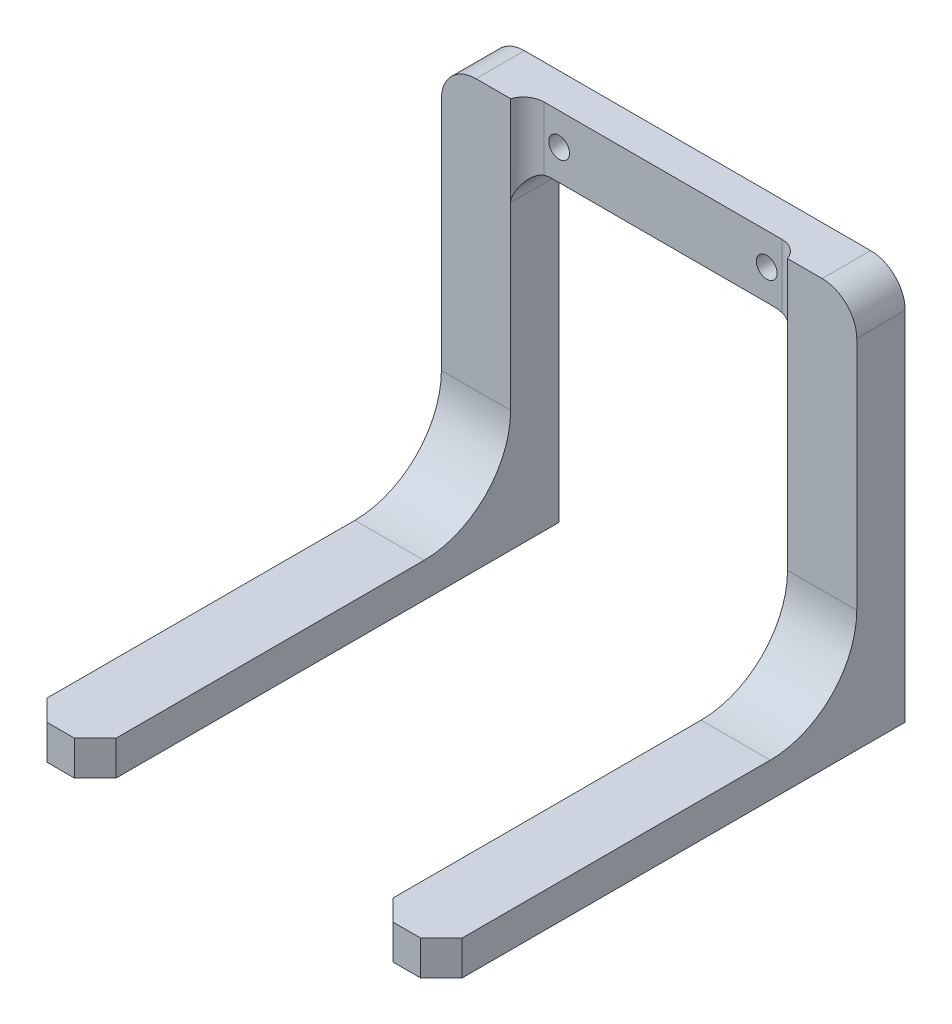
ISO-10303-21;
HEADER;
FILE_DESCRIPTION(('STEP AP214'),'2;1');
FILE_NAME('part.step','',(''),(''),'','','');
FILE_SCHEMA(('AUTOMOTIVE_DESIGN { 1 0 10303 214 1 1 1 1 }'));
ENDSEC;
DATA;
#1=APPLICATION_CONTEXT('core data for automotive mechanical design processes');
#2=APPLICATION_PROTOCOL_DEFINITION('international standard','automotive_design',2000,#1);
#3=PRODUCT_CONTEXT('',#1,'mechanical');
#4=PRODUCT('Part','Part','',(#3));
#5=PRODUCT_RELATED_PRODUCT_CATEGORY('part','',(#4));
#6=PRODUCT_DEFINITION_FORMATION('','',#4);
#7=PRODUCT_DEFINITION_CONTEXT('part definition',#1,'design');
#8=PRODUCT_DEFINITION('design','',#6,#7);
#9=PRODUCT_DEFINITION_SHAPE('','',#8);
#10=(LENGTH_UNIT() NAMED_UNIT(*) SI_UNIT(.MILLI.,.METRE.));
#11=(NAMED_UNIT(*) PLANE_ANGLE_UNIT() SI_UNIT($,.RADIAN.));
#12=(NAMED_UNIT(*) SI_UNIT($,.STERADIAN.) SOLID_ANGLE_UNIT());
#13=UNCERTAINTY_MEASURE_WITH_UNIT(LENGTH_MEASURE(1.E-05),#10,'distance_accuracy_value','');
#14=(GEOMETRIC_REPRESENTATION_CONTEXT(3) GLOBAL_UNCERTAINTY_ASSIGNED_CONTEXT((#13)) GLOBAL_UNIT_ASSIGNED_CONTEXT((#10,
#11,#12)) REPRESENTATION_CONTEXT('',''));
#15=CARTESIAN_POINT('',(0.,0.,0.));
#16=DIRECTION('',(0.,0.,1.));
#17=DIRECTION('',(1.,0.,0.));
#18=AXIS2_PLACEMENT_3D('',#15,#16,#17);
#19=CARTESIAN_POINT('',(-30.,9.,3.5));
#20=DIRECTION('',(0.,0.,-1.));
#21=DIRECTION('',(-1.,0.,0.));
#22=AXIS2_PLACEMENT_3D('',#19,#20,#21);
#23=PLANE('',#22);
#24=DIRECTION('',(0.,1.,0.));
#25=VECTOR('',#24,1.);
#26=CARTESIAN_POINT('',(20.,-47.5,3.5));
#27=LINE('',#26,#25);
#28=CARTESIAN_POINT('',(20.,-30.,3.5));
#29=VERTEX_POINT('',#28);
#30=CARTESIAN_POINT('',(20.,-4.,3.5));
#31=VERTEX_POINT('',#30);
#32=EDGE_CURVE('E230',#29,#31,#27,.T.);
#33=ORIENTED_EDGE('',*,*,#32,.F.);
#34=DIRECTION('',(-1.,0.,0.));
#35=VECTOR('',#34,1.);
#36=CARTESIAN_POINT('',(30.,-30.,3.5));
#37=LINE('',#36,#35);
#38=CARTESIAN_POINT('',(30.,-30.,3.5));
#39=VERTEX_POINT('',#38);
#40=EDGE_CURVE('E533',#29,#39,#37,.F.);
#41=ORIENTED_EDGE('',*,*,#40,.T.);
#42=DIRECTION('',(0.,-1.,0.));
#43=VECTOR('',#42,1.);
#44=CARTESIAN_POINT('',(30.,9.,3.5));
#45=LINE('',#44,#43);
#46=CARTESIAN_POINT('',(30.,4.,3.5));
#47=VERTEX_POINT('',#46);
#48=EDGE_CURVE('E264',#47,#39,#45,.T.);
#49=ORIENTED_EDGE('',*,*,#48,.F.);
#50=CARTESIAN_POINT('',(25.,4.,3.5));
#51=DIRECTION('',(0.,0.,-1.));
#52=DIRECTION('',(-1.,0.,0.));
#53=AXIS2_PLACEMENT_3D('',#50,#51,#52);
#54=CIRCLE('',#53,5.);
#55=CARTESIAN_POINT('',(25.,9.,3.5));
#56=VERTEX_POINT('',#55);
#57=EDGE_CURVE('E297',#47,#56,#54,.F.);
#58=ORIENTED_EDGE('',*,*,#57,.T.);
#59=DIRECTION('',(1.,0.,0.));
#60=VECTOR('',#59,1.);
#61=CARTESIAN_POINT('',(-30.,9.,3.5));
#62=LINE('',#61,#60);
#63=CARTESIAN_POINT('',(20.,9.,3.5));
#64=VERTEX_POINT('',#63);
#65=EDGE_CURVE('E261',#64,#56,#62,.T.);
#66=ORIENTED_EDGE('',*,*,#65,.F.);
#67=DIRECTION('',(0.,1.,0.));
#68=VECTOR('',#67,1.);
#69=CARTESIAN_POINT('',(20.,9.,3.5));
#70=LINE('',#69,#68);
#71=EDGE_CURVE('E250',#31,#64,#70,.T.);
#72=ORIENTED_EDGE('',*,*,#71,.F.);
#73=EDGE_LOOP('',(#33,#41,#49,#58,#66,#72));
#74=FACE_BOUND('',#73,.T.);
#75=ADVANCED_FACE('F33',(#74),#23,.F.);
#76=DIRECTION('',(0.,-1.,0.));
#77=VECTOR('',#76,1.);
#78=CARTESIAN_POINT('',(-30.,9.,3.5));
#79=LINE('',#78,#77);
#80=CARTESIAN_POINT('',(-30.,4.,3.5));
#81=VERTEX_POINT('',#80);
#82=CARTESIAN_POINT('',(-30.,-30.,3.5));
#83=VERTEX_POINT('',#82);
#84=EDGE_CURVE('E269',#81,#83,#79,.T.);
#85=ORIENTED_EDGE('',*,*,#84,.T.);
#86=DIRECTION('',(-1.,0.,0.));
#87=VECTOR('',#86,1.);
#88=CARTESIAN_POINT('',(-20.,-30.,3.5));
#89=LINE('',#88,#87);
#90=CARTESIAN_POINT('',(-20.,-30.,3.5));
#91=VERTEX_POINT('',#90);
#92=EDGE_CURVE('E438',#83,#91,#89,.F.);
#93=ORIENTED_EDGE('',*,*,#92,.T.);
#94=DIRECTION('',(0.,1.,0.));
#95=VECTOR('',#94,1.);
#96=CARTESIAN_POINT('',(-20.,-47.5,3.5));
#97=LINE('',#96,#95);
#98=CARTESIAN_POINT('',(-20.,-4.,3.5));
#99=VERTEX_POINT('',#98);
#100=EDGE_CURVE('E243',#91,#99,#97,.T.);
#101=ORIENTED_EDGE('',*,*,#100,.T.);
#102=DIRECTION('',(0.,-1.,0.));
#103=VECTOR('',#102,1.);
#104=CARTESIAN_POINT('',(-20.,9.,3.5));
#105=LINE('',#104,#103);
#106=CARTESIAN_POINT('',(-20.,9.,3.5));
#107=VERTEX_POINT('',#106);
#108=EDGE_CURVE('E245',#107,#99,#105,.T.);
#109=ORIENTED_EDGE('',*,*,#108,.F.);
#110=CARTESIAN_POINT('',(-25.,9.,3.5));
#111=VERTEX_POINT('',#110);
#112=EDGE_CURVE('E262',#111,#107,#62,.T.);
#113=ORIENTED_EDGE('',*,*,#112,.F.);
#114=CARTESIAN_POINT('',(-25.,4.,3.5));
#115=DIRECTION('',(0.,0.,-1.));
#116=DIRECTION('',(-1.,0.,0.));
#117=AXIS2_PLACEMENT_3D('',#114,#115,#116);
#118=CIRCLE('',#117,5.);
#119=EDGE_CURVE('E299',#111,#81,#118,.F.);
#120=ORIENTED_EDGE('',*,*,#119,.T.);
#121=EDGE_LOOP('',(#85,#93,#101,#109,#113,#120));
#122=FACE_BOUND('',#121,.T.);
#123=ADVANCED_FACE('F374',(#122),#23,.F.);
#124=CARTESIAN_POINT('',(0.,0.,0.));
#125=DIRECTION('',(0.,1.,0.));
#126=DIRECTION('',(0.,0.,1.));
#127=AXIS2_PLACEMENT_3D('',#124,#125,#126);
#128=PLANE('',#127);
#129=DIRECTION('',(-1.,0.,0.));
#130=VECTOR('',#129,1.);
#131=CARTESIAN_POINT('',(-30.,0.,-3.5));
#132=LINE('',#131,#130);
#133=CARTESIAN_POINT('',(16.,0.,-3.5));
#134=VERTEX_POINT('',#133);
#135=CARTESIAN_POINT('',(-16.,0.,-3.5));
#136=VERTEX_POINT('',#135);
#137=EDGE_CURVE('E253',#134,#136,#132,.T.);
#138=ORIENTED_EDGE('',*,*,#137,.F.);
#139=DIRECTION('',(0.,0.,-1.));
#140=VECTOR('',#139,1.);
#141=CARTESIAN_POINT('',(16.,0.,3.5));
#142=LINE('',#141,#140);
#143=CARTESIAN_POINT('',(16.,0.,1.5));
#144=VERTEX_POINT('',#143);
#145=EDGE_CURVE('E306',#134,#144,#142,.F.);
#146=ORIENTED_EDGE('',*,*,#145,.T.);
#147=DIRECTION('',(1.,0.,0.));
#148=VECTOR('',#147,1.);
#149=CARTESIAN_POINT('',(-20.,0.,1.5));
#150=LINE('',#149,#148);
#151=CARTESIAN_POINT('',(-16.,0.,1.5));
#152=VERTEX_POINT('',#151);
#153=EDGE_CURVE('E246',#152,#144,#150,.T.);
#154=ORIENTED_EDGE('',*,*,#153,.F.);
#155=DIRECTION('',(0.,0.,1.));
#156=VECTOR('',#155,1.);
#157=CARTESIAN_POINT('',(-16.,0.,-3.5));
#158=LINE('',#157,#156);
#159=EDGE_CURVE('E304',#152,#136,#158,.F.);
#160=ORIENTED_EDGE('',*,*,#159,.T.);
#161=EDGE_LOOP('',(#138,#146,#154,#160));
#162=FACE_BOUND('',#161,.T.);
#163=ADVANCED_FACE('F380',(#162),#128,.F.);
#164=CARTESIAN_POINT('',(30.,9.,-3.5));
#165=DIRECTION('',(-1.,0.,0.));
#166=DIRECTION('',(0.,0.,1.));
#167=AXIS2_PLACEMENT_3D('',#164,#165,#166);
#168=PLANE('',#167);
#169=DIRECTION('',(0.,0.,-1.));
#170=VECTOR('',#169,1.);
#171=CARTESIAN_POINT('',(30.,-42.5,63.5));
#172=LINE('',#171,#170);
#173=CARTESIAN_POINT('',(30.,-42.5,60.5));
#174=VERTEX_POINT('',#173);
#175=CARTESIAN_POINT('',(30.,-42.5,16.));
#176=VERTEX_POINT('',#175);
#177=EDGE_CURVE('E505',#174,#176,#172,.T.);
#178=ORIENTED_EDGE('',*,*,#177,.F.);
#179=DIRECTION('',(0.,-1.,0.));
#180=VECTOR('',#179,1.);
#181=CARTESIAN_POINT('',(30.,9.,60.5));
#182=LINE('',#181,#180);
#183=CARTESIAN_POINT('',(30.,-47.5,60.5));
#184=VERTEX_POINT('',#183);
#185=EDGE_CURVE('E464',#174,#184,#182,.T.);
#186=ORIENTED_EDGE('',*,*,#185,.T.);
#187=DIRECTION('',(0.,0.,1.));
#188=VECTOR('',#187,1.);
#189=CARTESIAN_POINT('',(30.,-47.5,3.5));
#190=LINE('',#189,#188);
#191=CARTESIAN_POINT('',(30.,-47.5,-3.5));
#192=VERTEX_POINT('',#191);
#193=EDGE_CURVE('E223',#192,#184,#190,.T.);
#194=ORIENTED_EDGE('',*,*,#193,.F.);
#195=DIRECTION('',(0.,-1.,0.));
#196=VECTOR('',#195,1.);
#197=CARTESIAN_POINT('',(30.,9.,-3.5));
#198=LINE('',#197,#196);
#199=CARTESIAN_POINT('',(30.,4.,-3.5));
#200=VERTEX_POINT('',#199);
#201=EDGE_CURVE('E222',#200,#192,#198,.T.);
#202=ORIENTED_EDGE('',*,*,#201,.F.);
#203=DIRECTION('',(0.,0.,-1.));
#204=VECTOR('',#203,1.);
#205=CARTESIAN_POINT('',(30.,4.,3.5));
#206=LINE('',#205,#204);
#207=EDGE_CURVE('E295',#200,#47,#206,.F.);
#208=ORIENTED_EDGE('',*,*,#207,.T.);
#209=ORIENTED_EDGE('',*,*,#48,.T.);
#210=CARTESIAN_POINT('',(30.,-30.,16.));
#211=DIRECTION('',(-1.,0.,0.));
#212=DIRECTION('',(0.,0.,1.));
#213=AXIS2_PLACEMENT_3D('',#210,#211,#212);
#214=CIRCLE('',#213,12.5);
#215=EDGE_CURVE('E454',#39,#176,#214,.T.);
#216=ORIENTED_EDGE('',*,*,#215,.T.);
#217=EDGE_LOOP('',(#178,#186,#194,#202,#208,#209,#216));
#218=FACE_BOUND('',#217,.T.);
#219=ADVANCED_FACE('F393',(#218),#168,.F.);
#220=CARTESIAN_POINT('',(-30.,9.,-3.5));
#221=DIRECTION('',(0.,0.,1.));
#222=DIRECTION('',(1.,0.,0.));
#223=AXIS2_PLACEMENT_3D('',#220,#221,#222);
#224=PLANE('',#223);
#225=CARTESIAN_POINT('',(14.9914863383138,4.41229031516984,-3.5));
#226=DIRECTION('',(0.,0.,-1.));
#227=DIRECTION('',(-1.,0.,0.));
#228=AXIS2_PLACEMENT_3D('',#225,#226,#227);
#229=CIRCLE('',#228,1.5);
#230=CARTESIAN_POINT('',(13.4914863383138,4.41229031516984,-3.5));
#231=VERTEX_POINT('',#230);
#232=EDGE_CURVE('E485',#231,#231,#229,.T.);
#233=ORIENTED_EDGE('',*,*,#232,.F.);
#234=EDGE_LOOP('',(#233));
#235=FACE_BOUND('',#234,.T.);
#236=CARTESIAN_POINT('',(-14.9914863383138,4.41229031516984,-3.5));
#237=DIRECTION('',(0.,0.,-1.));
#238=DIRECTION('',(-1.,0.,0.));
#239=AXIS2_PLACEMENT_3D('',#236,#237,#238);
#240=CIRCLE('',#239,1.5);
#241=CARTESIAN_POINT('',(-16.4914863383138,4.41229031516984,-3.5));
#242=VERTEX_POINT('',#241);
#243=EDGE_CURVE('E491',#242,#242,#240,.T.);
#244=ORIENTED_EDGE('',*,*,#243,.F.);
#245=EDGE_LOOP('',(#244));
#246=FACE_BOUND('',#245,.T.);
#247=DIRECTION('',(-1.,0.,0.));
#248=VECTOR('',#247,1.);
#249=CARTESIAN_POINT('',(-30.,9.,-3.5));
#250=LINE('',#249,#248);
#251=CARTESIAN_POINT('',(25.,9.,-3.5));
#252=VERTEX_POINT('',#251);
#253=CARTESIAN_POINT('',(-25.,9.,-3.5));
#254=VERTEX_POINT('',#253);
#255=EDGE_CURVE('E258',#252,#254,#250,.T.);
#256=ORIENTED_EDGE('',*,*,#255,.F.);
#257=CARTESIAN_POINT('',(25.,4.,-3.5));
#258=DIRECTION('',(0.,0.,1.));
#259=DIRECTION('',(1.,0.,0.));
#260=AXIS2_PLACEMENT_3D('',#257,#258,#259);
#261=CIRCLE('',#260,5.);
#262=EDGE_CURVE('E293',#252,#200,#261,.F.);
#263=ORIENTED_EDGE('',*,*,#262,.T.);
#264=ORIENTED_EDGE('',*,*,#201,.T.);
#265=DIRECTION('',(1.,0.,0.));
#266=VECTOR('',#265,1.);
#267=CARTESIAN_POINT('',(20.,-47.5,-3.5));
#268=LINE('',#267,#266);
#269=CARTESIAN_POINT('',(20.,-47.5,-3.5));
#270=VERTEX_POINT('',#269);
#271=EDGE_CURVE('E207',#270,#192,#268,.T.);
#272=ORIENTED_EDGE('',*,*,#271,.F.);
#273=DIRECTION('',(0.,1.,0.));
#274=VECTOR('',#273,1.);
#275=CARTESIAN_POINT('',(20.,-47.5,-3.5));
#276=LINE('',#275,#274);
#277=CARTESIAN_POINT('',(20.,-4.,-3.5));
#278=VERTEX_POINT('',#277);
#279=EDGE_CURVE('E220',#270,#278,#276,.T.);
#280=ORIENTED_EDGE('',*,*,#279,.T.);
#281=CARTESIAN_POINT('',(16.,-4.,-3.5));
#282=DIRECTION('',(0.,0.,1.));
#283=DIRECTION('',(1.,0.,0.));
#284=AXIS2_PLACEMENT_3D('',#281,#282,#283);
#285=CIRCLE('',#284,4.);
#286=EDGE_CURVE('E311',#278,#134,#285,.T.);
#287=ORIENTED_EDGE('',*,*,#286,.T.);
#288=ORIENTED_EDGE('',*,*,#137,.T.);
#289=CARTESIAN_POINT('',(-16.,-4.,-3.5));
#290=DIRECTION('',(0.,0.,1.));
#291=DIRECTION('',(1.,0.,0.));
#292=AXIS2_PLACEMENT_3D('',#289,#290,#291);
#293=CIRCLE('',#292,4.);
#294=CARTESIAN_POINT('',(-20.,-4.,-3.5));
#295=VERTEX_POINT('',#294);
#296=EDGE_CURVE('E536',#136,#295,#293,.T.);
#297=ORIENTED_EDGE('',*,*,#296,.T.);
#298=DIRECTION('',(0.,1.,0.));
#299=VECTOR('',#298,1.);
#300=CARTESIAN_POINT('',(-20.,-47.5,-3.5));
#301=LINE('',#300,#299);
#302=CARTESIAN_POINT('',(-20.,-47.5,-3.5));
#303=VERTEX_POINT('',#302);
#304=EDGE_CURVE('E240',#303,#295,#301,.T.);
#305=ORIENTED_EDGE('',*,*,#304,.F.);
#306=DIRECTION('',(1.,0.,0.));
#307=VECTOR('',#306,1.);
#308=CARTESIAN_POINT('',(-20.,-47.5,-3.5));
#309=LINE('',#308,#307);
#310=CARTESIAN_POINT('',(-30.,-47.5,-3.5));
#311=VERTEX_POINT('',#310);
#312=EDGE_CURVE('E238',#311,#303,#309,.T.);
#313=ORIENTED_EDGE('',*,*,#312,.F.);
#314=DIRECTION('',(0.,-1.,0.));
#315=VECTOR('',#314,1.);
#316=CARTESIAN_POINT('',(-30.,9.,-3.5));
#317=LINE('',#316,#315);
#318=CARTESIAN_POINT('',(-30.,4.,-3.5));
#319=VERTEX_POINT('',#318);
#320=EDGE_CURVE('E272',#319,#311,#317,.T.);
#321=ORIENTED_EDGE('',*,*,#320,.F.);
#322=CARTESIAN_POINT('',(-25.,4.,-3.5));
#323=DIRECTION('',(0.,0.,1.));
#324=DIRECTION('',(1.,0.,0.));
#325=AXIS2_PLACEMENT_3D('',#322,#323,#324);
#326=CIRCLE('',#325,5.);
#327=EDGE_CURVE('E291',#319,#254,#326,.F.);
#328=ORIENTED_EDGE('',*,*,#327,.T.);
#329=EDGE_LOOP('',(#256,#263,#264,#272,#280,#287,#288,#297,#305,#313,#321,#328));
#330=FACE_BOUND('',#329,.T.);
#331=ADVANCED_FACE('F219',(#235,#246,#330),#224,.F.);
#332=CARTESIAN_POINT('',(-30.,9.,-3.5));
#333=DIRECTION('',(1.,0.,0.));
#334=DIRECTION('',(0.,0.,-1.));
#335=AXIS2_PLACEMENT_3D('',#332,#333,#334);
#336=PLANE('',#335);
#337=DIRECTION('',(0.,0.,-1.));
#338=VECTOR('',#337,1.);
#339=CARTESIAN_POINT('',(-30.,-47.5,3.5));
#340=LINE('',#339,#338);
#341=CARTESIAN_POINT('',(-30.,-47.5,60.5));
#342=VERTEX_POINT('',#341);
#343=EDGE_CURVE('E232',#342,#311,#340,.T.);
#344=ORIENTED_EDGE('',*,*,#343,.F.);
#345=DIRECTION('',(0.,1.,0.));
#346=VECTOR('',#345,1.);
#347=CARTESIAN_POINT('',(-30.,9.,60.5));
#348=LINE('',#347,#346);
#349=CARTESIAN_POINT('',(-30.,-42.5,60.5));
#350=VERTEX_POINT('',#349);
#351=EDGE_CURVE('E11',#342,#350,#348,.T.);
#352=ORIENTED_EDGE('',*,*,#351,.T.);
#353=DIRECTION('',(0.,0.,-1.));
#354=VECTOR('',#353,1.);
#355=CARTESIAN_POINT('',(-30.,-42.5,63.5));
#356=LINE('',#355,#354);
#357=CARTESIAN_POINT('',(-30.,-42.5,16.));
#358=VERTEX_POINT('',#357);
#359=EDGE_CURVE('E513',#350,#358,#356,.T.);
#360=ORIENTED_EDGE('',*,*,#359,.T.);
#361=CARTESIAN_POINT('',(-30.,-30.,16.));
#362=DIRECTION('',(1.,0.,0.));
#363=DIRECTION('',(0.,0.,-1.));
#364=AXIS2_PLACEMENT_3D('',#361,#362,#363);
#365=CIRCLE('',#364,12.5);
#366=EDGE_CURVE('E449',#358,#83,#365,.T.);
#367=ORIENTED_EDGE('',*,*,#366,.T.);
#368=ORIENTED_EDGE('',*,*,#84,.F.);
#369=DIRECTION('',(0.,0.,1.));
#370=VECTOR('',#369,1.);
#371=CARTESIAN_POINT('',(-30.,4.,-3.5));
#372=LINE('',#371,#370);
#373=EDGE_CURVE('E301',#81,#319,#372,.F.);
#374=ORIENTED_EDGE('',*,*,#373,.T.);
#375=ORIENTED_EDGE('',*,*,#320,.T.);
#376=EDGE_LOOP('',(#344,#352,#360,#367,#368,#374,#375));
#377=FACE_BOUND('',#376,.T.);
#378=ADVANCED_FACE('F386',(#377),#336,.F.);
#379=CARTESIAN_POINT('',(0.,9.,0.));
#380=DIRECTION('',(0.,1.,0.));
#381=DIRECTION('',(0.,0.,1.));
#382=AXIS2_PLACEMENT_3D('',#379,#380,#381);
#383=PLANE('',#382);
#384=ORIENTED_EDGE('',*,*,#65,.T.);
#385=DIRECTION('',(0.,0.,-1.));
#386=VECTOR('',#385,1.);
#387=CARTESIAN_POINT('',(25.,9.,-3.5));
#388=LINE('',#387,#386);
#389=EDGE_CURVE('E288',#56,#252,#388,.T.);
#390=ORIENTED_EDGE('',*,*,#389,.T.);
#391=ORIENTED_EDGE('',*,*,#255,.T.);
#392=DIRECTION('',(0.,0.,1.));
#393=VECTOR('',#392,1.);
#394=CARTESIAN_POINT('',(-25.,9.,3.5));
#395=LINE('',#394,#393);
#396=EDGE_CURVE('E285',#254,#111,#395,.T.);
#397=ORIENTED_EDGE('',*,*,#396,.T.);
#398=ORIENTED_EDGE('',*,*,#112,.T.);
#399=CARTESIAN_POINT('',(-17.1715728752538,9.,4.5));
#400=DIRECTION('',(0.,1.,0.));
#401=DIRECTION('',(0.,0.,1.));
#402=AXIS2_PLACEMENT_3D('',#399,#400,#401);
#403=CIRCLE('',#402,3.);
#404=CARTESIAN_POINT('',(-17.1715728752538,9.,1.5));
#405=VERTEX_POINT('',#404);
#406=EDGE_CURVE('E281',#107,#405,#403,.F.);
#407=ORIENTED_EDGE('',*,*,#406,.T.);
#408=DIRECTION('',(-1.,0.,0.));
#409=VECTOR('',#408,1.);
#410=CARTESIAN_POINT('',(-20.,9.,1.5));
#411=LINE('',#410,#409);
#412=CARTESIAN_POINT('',(17.1715728752538,9.,1.5));
#413=VERTEX_POINT('',#412);
#414=EDGE_CURVE('E249',#413,#405,#411,.T.);
#415=ORIENTED_EDGE('',*,*,#414,.F.);
#416=CARTESIAN_POINT('',(17.1715728752538,9.,4.5));
#417=DIRECTION('',(0.,1.,0.));
#418=DIRECTION('',(0.,0.,1.));
#419=AXIS2_PLACEMENT_3D('',#416,#417,#418);
#420=CIRCLE('',#419,3.);
#421=EDGE_CURVE('E283',#413,#64,#420,.F.);
#422=ORIENTED_EDGE('',*,*,#421,.T.);
#423=EDGE_LOOP('',(#384,#390,#391,#397,#398,#407,#415,#422));
#424=FACE_BOUND('',#423,.T.);
#425=ADVANCED_FACE('F389',(#424),#383,.T.);
#426=CARTESIAN_POINT('',(0.,0.,1.5));
#427=DIRECTION('',(0.,0.,1.));
#428=DIRECTION('',(1.,0.,0.));
#429=AXIS2_PLACEMENT_3D('',#426,#427,#428);
#430=PLANE('',#429);
#431=CARTESIAN_POINT('',(14.9914863383138,4.41229031516984,1.5));
#432=DIRECTION('',(0.,0.,1.));
#433=DIRECTION('',(1.,0.,0.));
#434=AXIS2_PLACEMENT_3D('',#431,#432,#433);
#435=CIRCLE('',#434,1.5);
#436=CARTESIAN_POINT('',(16.4914863383138,4.41229031516984,1.5));
#437=VERTEX_POINT('',#436);
#438=EDGE_CURVE('E37',#437,#437,#435,.T.);
#439=ORIENTED_EDGE('',*,*,#438,.F.);
#440=EDGE_LOOP('',(#439));
#441=FACE_BOUND('',#440,.T.);
#442=CARTESIAN_POINT('',(-14.9914863383138,4.41229031516984,1.5));
#443=DIRECTION('',(0.,0.,1.));
#444=DIRECTION('',(1.,0.,0.));
#445=AXIS2_PLACEMENT_3D('',#442,#443,#444);
#446=CIRCLE('',#445,1.5);
#447=CARTESIAN_POINT('',(-13.4914863383138,4.41229031516984,1.5));
#448=VERTEX_POINT('',#447);
#449=EDGE_CURVE('E483',#448,#448,#446,.T.);
#450=ORIENTED_EDGE('',*,*,#449,.F.);
#451=EDGE_LOOP('',(#450));
#452=FACE_BOUND('',#451,.T.);
#453=ORIENTED_EDGE('',*,*,#414,.T.);
#454=DIRECTION('',(0.,1.,0.));
#455=VECTOR('',#454,1.);
#456=CARTESIAN_POINT('',(-17.1715728752538,0.,1.5));
#457=LINE('',#456,#455);
#458=CARTESIAN_POINT('',(-17.1715728752538,-0.175419369660313,1.5));
#459=VERTEX_POINT('',#458);
#460=EDGE_CURVE('E279',#405,#459,#457,.F.);
#461=ORIENTED_EDGE('',*,*,#460,.T.);
#462=CARTESIAN_POINT('',(-16.,-4.,1.5));
#463=DIRECTION('',(0.,0.,1.));
#464=DIRECTION('',(1.,0.,0.));
#465=AXIS2_PLACEMENT_3D('',#462,#463,#464);
#466=CIRCLE('',#465,4.);
#467=EDGE_CURVE('E539',#459,#152,#466,.F.);
#468=ORIENTED_EDGE('',*,*,#467,.T.);
#469=ORIENTED_EDGE('',*,*,#153,.T.);
#470=CARTESIAN_POINT('',(16.,-4.,1.5));
#471=DIRECTION('',(0.,0.,1.));
#472=DIRECTION('',(1.,0.,0.));
#473=AXIS2_PLACEMENT_3D('',#470,#471,#472);
#474=CIRCLE('',#473,4.);
#475=CARTESIAN_POINT('',(17.1715728752538,-0.175419369660312,1.5));
#476=VERTEX_POINT('',#475);
#477=EDGE_CURVE('E313',#144,#476,#474,.F.);
#478=ORIENTED_EDGE('',*,*,#477,.T.);
#479=DIRECTION('',(0.,-1.,0.));
#480=VECTOR('',#479,1.);
#481=CARTESIAN_POINT('',(17.1715728752538,9.,1.5));
#482=LINE('',#481,#480);
#483=EDGE_CURVE('E276',#476,#413,#482,.F.);
#484=ORIENTED_EDGE('',*,*,#483,.T.);
#485=EDGE_LOOP('',(#453,#461,#468,#469,#478,#484));
#486=FACE_BOUND('',#485,.T.);
#487=ADVANCED_FACE('F400',(#441,#452,#486),#430,.T.);
#488=CARTESIAN_POINT('',(-17.1715728752538,9.,4.5));
#489=DIRECTION('',(0.,-1.,0.));
#490=DIRECTION('',(0.,0.,-1.));
#491=AXIS2_PLACEMENT_3D('',#488,#489,#490);
#492=CYLINDRICAL_SURFACE('',#491,3.);
#493=ORIENTED_EDGE('',*,*,#406,.F.);
#494=ORIENTED_EDGE('',*,*,#108,.T.);
#495=CARTESIAN_POINT('',(-20.,-4.,3.5));
#496=CARTESIAN_POINT('',(-20.0000125172672,-3.94890423966607,3.50007867382474));
#497=CARTESIAN_POINT('',(-19.9990216171283,-3.89787219673649,3.49723123887229));
#498=CARTESIAN_POINT('',(-19.9951437107142,-3.79664296568643,3.48634183352001));
#499=CARTESIAN_POINT('',(-19.9922646096988,-3.7464431876432,3.47832152251453));
#500=CARTESIAN_POINT('',(-19.9847931730004,-3.64812337707943,3.45793537448314));
#501=CARTESIAN_POINT('',(-19.9802354410995,-3.59998187139829,3.44565758248557));
#502=CARTESIAN_POINT('',(-19.9695279771533,-3.5048859637406,3.41756017926966));
#503=CARTESIAN_POINT('',(-19.9633763969301,-3.45793300981884,3.40173645919838));
#504=CARTESIAN_POINT('',(-19.9445430737231,-3.33128310366103,3.35472422483758));
#505=CARTESIAN_POINT('',(-19.9303815309757,-3.25283577692916,3.32078036701804));
#506=CARTESIAN_POINT('',(-19.8980468531149,-3.09922337385732,3.24782611475226));
#507=CARTESIAN_POINT('',(-19.8798707356597,-3.02406078766757,3.20881196260823));
#508=CARTESIAN_POINT('',(-19.8394550345246,-2.87546055354649,3.1272269282467));
#509=CARTESIAN_POINT('',(-19.8171645668805,-2.80205920008103,3.08461560401368));
#510=CARTESIAN_POINT('',(-19.7687756983967,-2.65756478477283,2.99766170485277));
#511=CARTESIAN_POINT('',(-19.7426761583598,-2.58647242129427,2.95331861491361));
#512=CARTESIAN_POINT('',(-19.6672424085954,-2.39759117697847,2.83278315717427));
#513=CARTESIAN_POINT('',(-19.614361222708,-2.28166517784152,2.75586154560395));
#514=CARTESIAN_POINT('',(-19.4975291311022,-2.05486439391033,2.60283718375395));
#515=CARTESIAN_POINT('',(-19.4335717616198,-1.94399260661188,2.52673493933424));
#516=CARTESIAN_POINT('',(-19.2946047093908,-1.72800070817396,2.37796216012691));
#517=CARTESIAN_POINT('',(-19.2196538093976,-1.62285385078056,2.30527593270951));
#518=CARTESIAN_POINT('',(-19.0581311355653,-1.4183745064879,2.16497634666987));
#519=CARTESIAN_POINT('',(-18.9715676348955,-1.319037951846,2.09735942949252));
#520=CARTESIAN_POINT('',(-18.7613277019077,-1.10106752988893,1.9518288882481));
#521=CARTESIAN_POINT('',(-18.6339498418783,-0.984495471204354,1.87608766246497));
#522=CARTESIAN_POINT('',(-18.3599512538888,-0.765628297290276,1.74120885379916));
#523=CARTESIAN_POINT('',(-18.2133937487442,-0.663288459369918,1.68201864063746));
#524=CARTESIAN_POINT('',(-17.9903673525854,-0.529452915053368,1.61302779863489));
#525=CARTESIAN_POINT('',(-17.9210006040936,-0.49056098986695,1.59420194413775));
#526=CARTESIAN_POINT('',(-17.7791904363639,-0.416584417590028,1.5612768534233));
#527=CARTESIAN_POINT('',(-17.7067482422311,-0.381498273902102,1.54717575463784));
#528=CARTESIAN_POINT('',(-17.5584765871954,-0.31519376389886,1.52410005428315));
#529=CARTESIAN_POINT('',(-17.4826217579957,-0.284014696392018,1.51517469895951));
#530=CARTESIAN_POINT('',(-17.3286369446797,-0.22620395640122,1.50311397895616));
#531=CARTESIAN_POINT('',(-17.2505039887708,-0.199578566099143,1.49998655544725));
#532=CARTESIAN_POINT('',(-17.1715728752538,-0.175419369660315,1.5));
#533=B_SPLINE_CURVE_WITH_KNOTS('',3,(#495,#496,#497,#498,#499,#500,#501,#502,#503,#504,#505,
#506,#507,#508,#509,#510,#511,#512,#513,#514,#515,#516,#517,#518,#519,#520,#521,#522,#523,#524,
#525,#526,#527,#528,#529,#530,#531,#532),.UNSPECIFIED.,.F.,.F.,(4,2,2,2,2,2,2,2,2,2,2,2,2,2,2,2,
2,2,4),(0.,0.153096926409289,0.305556944657195,0.455035564188024,0.604688296411025,
0.864134554185803,1.12377420120096,1.38687104740197,1.65004674107332,2.09601623300166,
2.5422468632096,2.98617304174798,3.42978461694371,3.99356360010604,4.55552889884545,
4.80047045679019,5.04531534125343,5.29245319294226,5.53992928904981),.UNSPECIFIED.);
#534=EDGE_CURVE('E325',#99,#459,#533,.T.);
#535=ORIENTED_EDGE('',*,*,#534,.T.);
#536=ORIENTED_EDGE('',*,*,#460,.F.);
#537=EDGE_LOOP('',(#493,#494,#535,#536));
#538=FACE_BOUND('',#537,.T.);
#539=ADVANCED_FACE('F397',(#538),#492,.F.);
#540=CARTESIAN_POINT('',(17.1715728752538,9.,4.5));
#541=DIRECTION('',(0.,1.,0.));
#542=DIRECTION('',(0.,0.,1.));
#543=AXIS2_PLACEMENT_3D('',#540,#541,#542);
#544=CYLINDRICAL_SURFACE('',#543,3.);
#545=ORIENTED_EDGE('',*,*,#483,.F.);
#546=CARTESIAN_POINT('',(17.1715728752538,-0.175419369660312,1.5));
#547=CARTESIAN_POINT('',(17.2522919108185,-0.200124446777156,1.49998540504215));
#548=CARTESIAN_POINT('',(17.3321739729097,-0.227409727152066,1.5032565629508));
#549=CARTESIAN_POINT('',(17.4895406598214,-0.286741846294452,1.51585956350559));
#550=CARTESIAN_POINT('',(17.5670284174486,-0.318782114403811,1.52518310175429));
#551=CARTESIAN_POINT('',(17.7183718661869,-0.386963613317488,1.54926571716145));
#552=CARTESIAN_POINT('',(17.7922554403629,-0.423062176765637,1.56397134298444));
#553=CARTESIAN_POINT('',(17.9367815212361,-0.499206312119634,1.59828032781496));
#554=CARTESIAN_POINT('',(18.0074229638663,-0.539253166468885,1.61788528136631));
#555=CARTESIAN_POINT('',(18.2132299210952,-0.664248766087559,1.68298863133375));
#556=CARTESIAN_POINT('',(18.3432240528672,-0.754485066939354,1.7349384889071));
#557=CARTESIAN_POINT('',(18.5882959261165,-0.946299794262513,1.8520845690521));
#558=CARTESIAN_POINT('',(18.7033274575593,-1.0479116351027,1.91732030284656));
#559=CARTESIAN_POINT('',(18.982021767921,-1.3231589749744,2.09916446291514));
#560=CARTESIAN_POINT('',(19.134034061349,-1.50375175638001,2.2232855301071));
#561=CARTESIAN_POINT('',(19.3342318165327,-1.78723408443105,2.4187363339481));
#562=CARTESIAN_POINT('',(19.3963882982851,-1.88395684688158,2.48552145229454));
#563=CARTESIAN_POINT('',(19.5117489866454,-2.08148750663202,2.62078463001524));
#564=CARTESIAN_POINT('',(19.5649565245898,-2.18229386635297,2.68926204847701));
#565=CARTESIAN_POINT('',(19.6482237869499,-2.35777041489578,2.8059739519584));
#566=CARTESIAN_POINT('',(19.6804862623243,-2.43139646176921,2.8542319547266));
#567=CARTESIAN_POINT('',(19.7406878474535,-2.58093306818485,2.9498913272683));
#568=CARTESIAN_POINT('',(19.7686276443082,-2.65684326236046,2.99729283212404));
#569=CARTESIAN_POINT('',(19.8201524816792,-2.81127676500628,3.09009322094868));
#570=CARTESIAN_POINT('',(19.8437397581805,-2.88979870715643,3.13549312400955));
#571=CARTESIAN_POINT('',(19.886439960422,-3.05002617248688,3.22256345667645));
#572=CARTESIAN_POINT('',(19.90555622495,-3.13172926657006,3.26423665479209));
#573=CARTESIAN_POINT('',(19.9400965501745,-3.30437687226672,3.34360501490337));
#574=CARTESIAN_POINT('',(19.95521352332,-3.39557955010446,3.38088626737302));
#575=CARTESIAN_POINT('',(19.9792747019083,-3.58270714930961,3.44267423188358));
#576=CARTESIAN_POINT('',(19.9882596142488,-3.67859630972075,3.46726491726658));
#577=CARTESIAN_POINT('',(19.9957988331695,-3.81300708234541,3.48817848351843));
#578=CARTESIAN_POINT('',(19.9973651570008,-3.8501382537838,3.4925711278243));
#579=CARTESIAN_POINT('',(19.9994694906118,-3.92483802033579,3.49849835945676));
#580=CARTESIAN_POINT('',(20.0000024266962,-3.96240786711894,3.50001884420594));
#581=CARTESIAN_POINT('',(20.,-4.,3.5));
#582=B_SPLINE_CURVE_WITH_KNOTS('',3,(#546,#547,#548,#549,#550,#551,#552,#553,#554,#555,#556,
#557,#558,#559,#560,#561,#562,#563,#564,#565,#566,#567,#568,#569,#570,#571,#572,#573,#574,#575,
#576,#577,#578,#579,#580,#581),.UNSPECIFIED.,.F.,.F.,(4,2,2,2,2,2,2,2,2,2,2,2,2,2,2,2,2,4),(0.,
0.253071871520941,0.50579723806022,0.756077947453127,1.00644021997404,1.50404344771215,
2.00314870629897,2.79843980779802,3.1970908388133,3.59559313782901,3.87675709228644,
4.15787630905648,4.43885070421056,4.71961460323953,5.01800244121171,5.31438968347081,
5.42654345033749,5.53924648577563),.UNSPECIFIED.);
#583=EDGE_CURVE('E316',#476,#31,#582,.T.);
#584=ORIENTED_EDGE('',*,*,#583,.T.);
#585=ORIENTED_EDGE('',*,*,#71,.T.);
#586=ORIENTED_EDGE('',*,*,#421,.F.);
#587=EDGE_LOOP('',(#545,#584,#585,#586));
#588=FACE_BOUND('',#587,.T.);
#589=ADVANCED_FACE('F333',(#588),#544,.F.);
#590=CARTESIAN_POINT('',(25.,4.,0.));
#591=DIRECTION('',(0.,0.,1.));
#592=DIRECTION('',(1.,0.,0.));
#593=AXIS2_PLACEMENT_3D('',#590,#591,#592);
#594=CYLINDRICAL_SURFACE('',#593,5.);
#595=ORIENTED_EDGE('',*,*,#57,.F.);
#596=ORIENTED_EDGE('',*,*,#207,.F.);
#597=ORIENTED_EDGE('',*,*,#262,.F.);
#598=ORIENTED_EDGE('',*,*,#389,.F.);
#599=EDGE_LOOP('',(#595,#596,#597,#598));
#600=FACE_BOUND('',#599,.T.);
#601=ADVANCED_FACE('F406',(#600),#594,.T.);
#602=CARTESIAN_POINT('',(-25.,4.,0.));
#603=DIRECTION('',(0.,0.,-1.));
#604=DIRECTION('',(-1.,0.,0.));
#605=AXIS2_PLACEMENT_3D('',#602,#603,#604);
#606=CYLINDRICAL_SURFACE('',#605,5.);
#607=ORIENTED_EDGE('',*,*,#327,.F.);
#608=ORIENTED_EDGE('',*,*,#373,.F.);
#609=ORIENTED_EDGE('',*,*,#119,.F.);
#610=ORIENTED_EDGE('',*,*,#396,.F.);
#611=EDGE_LOOP('',(#607,#608,#609,#610));
#612=FACE_BOUND('',#611,.T.);
#613=ADVANCED_FACE('F342',(#612),#606,.T.);
#614=CARTESIAN_POINT('',(-20.,-47.5,3.5));
#615=DIRECTION('',(-1.,0.,0.));
#616=DIRECTION('',(0.,0.,1.));
#617=AXIS2_PLACEMENT_3D('',#614,#615,#616);
#618=PLANE('',#617);
#619=DIRECTION('',(0.,0.,-1.));
#620=VECTOR('',#619,1.);
#621=CARTESIAN_POINT('',(-20.,-42.5,63.5));
#622=LINE('',#621,#620);
#623=CARTESIAN_POINT('',(-20.,-42.5,60.5));
#624=VERTEX_POINT('',#623);
#625=CARTESIAN_POINT('',(-20.,-42.5,16.));
#626=VERTEX_POINT('',#625);
#627=EDGE_CURVE('E214',#624,#626,#622,.T.);
#628=ORIENTED_EDGE('',*,*,#627,.F.);
#629=DIRECTION('',(0.,-1.,0.));
#630=VECTOR('',#629,1.);
#631=CARTESIAN_POINT('',(-20.,-47.5,60.5));
#632=LINE('',#631,#630);
#633=CARTESIAN_POINT('',(-20.,-47.5,60.5));
#634=VERTEX_POINT('',#633);
#635=EDGE_CURVE('E58',#624,#634,#632,.T.);
#636=ORIENTED_EDGE('',*,*,#635,.T.);
#637=DIRECTION('',(0.,0.,1.));
#638=VECTOR('',#637,1.);
#639=CARTESIAN_POINT('',(-20.,-47.5,3.5));
#640=LINE('',#639,#638);
#641=EDGE_CURVE('E229',#303,#634,#640,.T.);
#642=ORIENTED_EDGE('',*,*,#641,.F.);
#643=ORIENTED_EDGE('',*,*,#304,.T.);
#644=DIRECTION('',(0.,0.,1.));
#645=VECTOR('',#644,1.);
#646=CARTESIAN_POINT('',(-20.,-4.,3.5));
#647=LINE('',#646,#645);
#648=EDGE_CURVE('E308',#295,#99,#647,.T.);
#649=ORIENTED_EDGE('',*,*,#648,.T.);
#650=ORIENTED_EDGE('',*,*,#100,.F.);
#651=CARTESIAN_POINT('',(-20.,-30.,16.));
#652=DIRECTION('',(-1.,0.,0.));
#653=DIRECTION('',(0.,0.,1.));
#654=AXIS2_PLACEMENT_3D('',#651,#652,#653);
#655=CIRCLE('',#654,12.5);
#656=EDGE_CURVE('E442',#91,#626,#655,.T.);
#657=ORIENTED_EDGE('',*,*,#656,.T.);
#658=EDGE_LOOP('',(#628,#636,#642,#643,#649,#650,#657));
#659=FACE_BOUND('',#658,.T.);
#660=ADVANCED_FACE('F441',(#659),#618,.F.);
#661=CARTESIAN_POINT('',(0.,-47.5,0.));
#662=DIRECTION('',(0.,1.,0.));
#663=DIRECTION('',(0.,0.,1.));
#664=AXIS2_PLACEMENT_3D('',#661,#662,#663);
#665=PLANE('',#664);
#666=ORIENTED_EDGE('',*,*,#641,.T.);
#667=DIRECTION('',(0.707106781186546,0.,-0.707106781186549));
#668=VECTOR('',#667,1.);
#669=CARTESIAN_POINT('',(-23.,-47.5,63.5));
#670=LINE('',#669,#668);
#671=CARTESIAN_POINT('',(-23.,-47.5,63.5));
#672=VERTEX_POINT('',#671);
#673=EDGE_CURVE('E42',#634,#672,#670,.F.);
#674=ORIENTED_EDGE('',*,*,#673,.T.);
#675=DIRECTION('',(1.,0.,0.));
#676=VECTOR('',#675,1.);
#677=CARTESIAN_POINT('',(-30.,-47.5,63.5));
#678=LINE('',#677,#676);
#679=CARTESIAN_POINT('',(-27.,-47.5,63.5));
#680=VERTEX_POINT('',#679);
#681=EDGE_CURVE('E507',#680,#672,#678,.T.);
#682=ORIENTED_EDGE('',*,*,#681,.F.);
#683=DIRECTION('',(0.707106781186546,0.,0.707106781186549));
#684=VECTOR('',#683,1.);
#685=CARTESIAN_POINT('',(-27.,-47.5,63.5));
#686=LINE('',#685,#684);
#687=EDGE_CURVE('E50',#680,#342,#686,.F.);
#688=ORIENTED_EDGE('',*,*,#687,.T.);
#689=ORIENTED_EDGE('',*,*,#343,.T.);
#690=ORIENTED_EDGE('',*,*,#312,.T.);
#691=EDGE_LOOP('',(#666,#674,#682,#688,#689,#690));
#692=FACE_BOUND('',#691,.T.);
#693=ADVANCED_FACE('F548',(#692),#665,.F.);
#694=CARTESIAN_POINT('',(20.,-47.5,3.5));
#695=DIRECTION('',(1.,0.,0.));
#696=DIRECTION('',(0.,0.,-1.));
#697=AXIS2_PLACEMENT_3D('',#694,#695,#696);
#698=PLANE('',#697);
#699=DIRECTION('',(0.,0.,-1.));
#700=VECTOR('',#699,1.);
#701=CARTESIAN_POINT('',(20.,-47.5,3.5));
#702=LINE('',#701,#700);
#703=CARTESIAN_POINT('',(20.,-47.5,60.5));
#704=VERTEX_POINT('',#703);
#705=EDGE_CURVE('E203',#704,#270,#702,.T.);
#706=ORIENTED_EDGE('',*,*,#705,.F.);
#707=DIRECTION('',(0.,1.,0.));
#708=VECTOR('',#707,1.);
#709=CARTESIAN_POINT('',(20.,-47.5,60.5));
#710=LINE('',#709,#708);
#711=CARTESIAN_POINT('',(20.,-42.5,60.5));
#712=VERTEX_POINT('',#711);
#713=EDGE_CURVE('E469',#704,#712,#710,.T.);
#714=ORIENTED_EDGE('',*,*,#713,.T.);
#715=DIRECTION('',(0.,0.,-1.));
#716=VECTOR('',#715,1.);
#717=CARTESIAN_POINT('',(20.,-42.5,63.5));
#718=LINE('',#717,#716);
#719=CARTESIAN_POINT('',(20.,-42.5,16.));
#720=VERTEX_POINT('',#719);
#721=EDGE_CURVE('E503',#712,#720,#718,.T.);
#722=ORIENTED_EDGE('',*,*,#721,.T.);
#723=CARTESIAN_POINT('',(20.,-30.,16.));
#724=DIRECTION('',(1.,0.,0.));
#725=DIRECTION('',(0.,0.,-1.));
#726=AXIS2_PLACEMENT_3D('',#723,#724,#725);
#727=CIRCLE('',#726,12.5);
#728=EDGE_CURVE('E528',#720,#29,#727,.T.);
#729=ORIENTED_EDGE('',*,*,#728,.T.);
#730=ORIENTED_EDGE('',*,*,#32,.T.);
#731=DIRECTION('',(0.,0.,-1.));
#732=VECTOR('',#731,1.);
#733=CARTESIAN_POINT('',(20.,-4.,-3.5));
#734=LINE('',#733,#732);
#735=EDGE_CURVE('E228',#31,#278,#734,.T.);
#736=ORIENTED_EDGE('',*,*,#735,.T.);
#737=ORIENTED_EDGE('',*,*,#279,.F.);
#738=EDGE_LOOP('',(#706,#714,#722,#729,#730,#736,#737));
#739=FACE_BOUND('',#738,.T.);
#740=ADVANCED_FACE('F226',(#739),#698,.F.);
#741=CARTESIAN_POINT('',(0.,-47.5,0.));
#742=DIRECTION('',(0.,-1.,0.));
#743=DIRECTION('',(0.,0.,-1.));
#744=AXIS2_PLACEMENT_3D('',#741,#742,#743);
#745=PLANE('',#744);
#746=ORIENTED_EDGE('',*,*,#193,.T.);
#747=DIRECTION('',(0.707106781186546,0.,-0.707106781186549));
#748=VECTOR('',#747,1.);
#749=CARTESIAN_POINT('',(45.2500000000001,-47.5,45.2499999999999));
#750=LINE('',#749,#748);
#751=CARTESIAN_POINT('',(27.,-47.5,63.5));
#752=VERTEX_POINT('',#751);
#753=EDGE_CURVE('E467',#184,#752,#750,.F.);
#754=ORIENTED_EDGE('',*,*,#753,.T.);
#755=DIRECTION('',(1.,0.,0.));
#756=VECTOR('',#755,1.);
#757=CARTESIAN_POINT('',(20.,-47.5,63.5));
#758=LINE('',#757,#756);
#759=CARTESIAN_POINT('',(23.,-47.5,63.5));
#760=VERTEX_POINT('',#759);
#761=EDGE_CURVE('E489',#760,#752,#758,.T.);
#762=ORIENTED_EDGE('',*,*,#761,.F.);
#763=DIRECTION('',(0.707106781186546,0.,0.707106781186549));
#764=VECTOR('',#763,1.);
#765=CARTESIAN_POINT('',(-20.25,-47.5,20.2499999999999));
#766=LINE('',#765,#764);
#767=EDGE_CURVE('E210',#760,#704,#766,.F.);
#768=ORIENTED_EDGE('',*,*,#767,.T.);
#769=ORIENTED_EDGE('',*,*,#705,.T.);
#770=ORIENTED_EDGE('',*,*,#271,.T.);
#771=EDGE_LOOP('',(#746,#754,#762,#768,#769,#770));
#772=FACE_BOUND('',#771,.T.);
#773=ADVANCED_FACE('F206',(#772),#745,.T.);
#774=CARTESIAN_POINT('',(16.,-4.,3.5));
#775=DIRECTION('',(0.,0.,1.));
#776=DIRECTION('',(1.,0.,0.));
#777=AXIS2_PLACEMENT_3D('',#774,#775,#776);
#778=CYLINDRICAL_SURFACE('',#777,4.);
#779=ORIENTED_EDGE('',*,*,#477,.F.);
#780=ORIENTED_EDGE('',*,*,#145,.F.);
#781=ORIENTED_EDGE('',*,*,#286,.F.);
#782=ORIENTED_EDGE('',*,*,#735,.F.);
#783=ORIENTED_EDGE('',*,*,#583,.F.);
#784=EDGE_LOOP('',(#779,#780,#781,#782,#783));
#785=FACE_BOUND('',#784,.T.);
#786=ADVANCED_FACE('F336',(#785),#778,.F.);
#787=CARTESIAN_POINT('',(-16.,-4.,3.5));
#788=DIRECTION('',(0.,0.,-1.));
#789=DIRECTION('',(-1.,0.,0.));
#790=AXIS2_PLACEMENT_3D('',#787,#788,#789);
#791=CYLINDRICAL_SURFACE('',#790,4.);
#792=ORIENTED_EDGE('',*,*,#296,.F.);
#793=ORIENTED_EDGE('',*,*,#159,.F.);
#794=ORIENTED_EDGE('',*,*,#467,.F.);
#795=ORIENTED_EDGE('',*,*,#534,.F.);
#796=ORIENTED_EDGE('',*,*,#648,.F.);
#797=EDGE_LOOP('',(#792,#793,#794,#795,#796));
#798=FACE_BOUND('',#797,.T.);
#799=ADVANCED_FACE('F340',(#798),#791,.F.);
#800=CARTESIAN_POINT('',(-30.,-42.5,63.5));
#801=DIRECTION('',(0.,-1.,0.));
#802=DIRECTION('',(0.,0.,-1.));
#803=AXIS2_PLACEMENT_3D('',#800,#801,#802);
#804=PLANE('',#803);
#805=DIRECTION('',(-1.,0.,0.));
#806=VECTOR('',#805,1.);
#807=CARTESIAN_POINT('',(-30.,-42.5,63.5));
#808=LINE('',#807,#806);
#809=CARTESIAN_POINT('',(-23.,-42.5,63.5));
#810=VERTEX_POINT('',#809);
#811=CARTESIAN_POINT('',(-27.,-42.5,63.5));
#812=VERTEX_POINT('',#811);
#813=EDGE_CURVE('E510',#810,#812,#808,.T.);
#814=ORIENTED_EDGE('',*,*,#813,.F.);
#815=DIRECTION('',(-0.707106781186546,0.,0.707106781186549));
#816=VECTOR('',#815,1.);
#817=CARTESIAN_POINT('',(-23.,-42.5,63.5));
#818=LINE('',#817,#816);
#819=EDGE_CURVE('E479',#810,#624,#818,.F.);
#820=ORIENTED_EDGE('',*,*,#819,.T.);
#821=ORIENTED_EDGE('',*,*,#627,.T.);
#822=DIRECTION('',(-1.,0.,0.));
#823=VECTOR('',#822,1.);
#824=CARTESIAN_POINT('',(-30.,-42.5,16.));
#825=LINE('',#824,#823);
#826=EDGE_CURVE('E447',#626,#358,#825,.T.);
#827=ORIENTED_EDGE('',*,*,#826,.T.);
#828=ORIENTED_EDGE('',*,*,#359,.F.);
#829=DIRECTION('',(-0.707106781186546,0.,-0.707106781186549));
#830=VECTOR('',#829,1.);
#831=CARTESIAN_POINT('',(-27.,-42.5,63.5));
#832=LINE('',#831,#830);
#833=EDGE_CURVE('E477',#350,#812,#832,.F.);
#834=ORIENTED_EDGE('',*,*,#833,.T.);
#835=EDGE_LOOP('',(#814,#820,#821,#827,#828,#834));
#836=FACE_BOUND('',#835,.T.);
#837=ADVANCED_FACE('F346',(#836),#804,.F.);
#838=CARTESIAN_POINT('',(0.,0.,63.5));
#839=DIRECTION('',(0.,0.,-1.));
#840=DIRECTION('',(-1.,0.,0.));
#841=AXIS2_PLACEMENT_3D('',#838,#839,#840);
#842=PLANE('',#841);
#843=ORIENTED_EDGE('',*,*,#681,.T.);
#844=DIRECTION('',(0.,1.,0.));
#845=VECTOR('',#844,1.);
#846=CARTESIAN_POINT('',(-23.,0.,63.5));
#847=LINE('',#846,#845);
#848=EDGE_CURVE('E474',#672,#810,#847,.T.);
#849=ORIENTED_EDGE('',*,*,#848,.T.);
#850=ORIENTED_EDGE('',*,*,#813,.T.);
#851=DIRECTION('',(0.,-1.,0.));
#852=VECTOR('',#851,1.);
#853=CARTESIAN_POINT('',(-27.,0.,63.5));
#854=LINE('',#853,#852);
#855=EDGE_CURVE('E471',#812,#680,#854,.T.);
#856=ORIENTED_EDGE('',*,*,#855,.T.);
#857=EDGE_LOOP('',(#843,#849,#850,#856));
#858=FACE_BOUND('',#857,.T.);
#859=ADVANCED_FACE('F550',(#858),#842,.F.);
#860=CARTESIAN_POINT('',(20.,-42.5,63.5));
#861=DIRECTION('',(0.,-1.,0.));
#862=DIRECTION('',(0.,0.,-1.));
#863=AXIS2_PLACEMENT_3D('',#860,#861,#862);
#864=PLANE('',#863);
#865=DIRECTION('',(-1.,0.,0.));
#866=VECTOR('',#865,1.);
#867=CARTESIAN_POINT('',(20.,-42.5,63.5));
#868=LINE('',#867,#866);
#869=CARTESIAN_POINT('',(27.,-42.5,63.5));
#870=VERTEX_POINT('',#869);
#871=CARTESIAN_POINT('',(23.,-42.5,63.5));
#872=VERTEX_POINT('',#871);
#873=EDGE_CURVE('E500',#870,#872,#868,.T.);
#874=ORIENTED_EDGE('',*,*,#873,.F.);
#875=DIRECTION('',(-0.707106781186546,0.,0.707106781186549));
#876=VECTOR('',#875,1.);
#877=CARTESIAN_POINT('',(27.,-42.5,63.5));
#878=LINE('',#877,#876);
#879=EDGE_CURVE('E462',#870,#174,#878,.F.);
#880=ORIENTED_EDGE('',*,*,#879,.T.);
#881=ORIENTED_EDGE('',*,*,#177,.T.);
#882=DIRECTION('',(-1.,0.,0.));
#883=VECTOR('',#882,1.);
#884=CARTESIAN_POINT('',(20.,-42.5,16.));
#885=LINE('',#884,#883);
#886=EDGE_CURVE('E532',#176,#720,#885,.T.);
#887=ORIENTED_EDGE('',*,*,#886,.T.);
#888=ORIENTED_EDGE('',*,*,#721,.F.);
#889=DIRECTION('',(-0.707106781186546,0.,-0.707106781186549));
#890=VECTOR('',#889,1.);
#891=CARTESIAN_POINT('',(23.,-42.5,63.5));
#892=LINE('',#891,#890);
#893=EDGE_CURVE('E460',#712,#872,#892,.F.);
#894=ORIENTED_EDGE('',*,*,#893,.T.);
#895=EDGE_LOOP('',(#874,#880,#881,#887,#888,#894));
#896=FACE_BOUND('',#895,.T.);
#897=ADVANCED_FACE('F522',(#896),#864,.F.);
#898=CARTESIAN_POINT('',(0.,0.,63.5));
#899=DIRECTION('',(0.,0.,-1.));
#900=DIRECTION('',(-1.,0.,0.));
#901=AXIS2_PLACEMENT_3D('',#898,#899,#900);
#902=PLANE('',#901);
#903=ORIENTED_EDGE('',*,*,#761,.T.);
#904=DIRECTION('',(0.,1.,0.));
#905=VECTOR('',#904,1.);
#906=CARTESIAN_POINT('',(27.,0.,63.5));
#907=LINE('',#906,#905);
#908=EDGE_CURVE('E452',#752,#870,#907,.T.);
#909=ORIENTED_EDGE('',*,*,#908,.T.);
#910=ORIENTED_EDGE('',*,*,#873,.T.);
#911=DIRECTION('',(0.,-1.,0.));
#912=VECTOR('',#911,1.);
#913=CARTESIAN_POINT('',(23.,0.,63.5));
#914=LINE('',#913,#912);
#915=EDGE_CURVE('E448',#872,#760,#914,.T.);
#916=ORIENTED_EDGE('',*,*,#915,.T.);
#917=EDGE_LOOP('',(#903,#909,#910,#916));
#918=FACE_BOUND('',#917,.T.);
#919=ADVANCED_FACE('F352',(#918),#902,.F.);
#920=CARTESIAN_POINT('',(20.,-30.,16.));
#921=DIRECTION('',(1.,0.,0.));
#922=DIRECTION('',(0.,0.,-1.));
#923=AXIS2_PLACEMENT_3D('',#920,#921,#922);
#924=CYLINDRICAL_SURFACE('',#923,12.5);
#925=ORIENTED_EDGE('',*,*,#215,.F.);
#926=ORIENTED_EDGE('',*,*,#40,.F.);
#927=ORIENTED_EDGE('',*,*,#728,.F.);
#928=ORIENTED_EDGE('',*,*,#886,.F.);
#929=EDGE_LOOP('',(#925,#926,#927,#928));
#930=FACE_BOUND('',#929,.T.);
#931=ADVANCED_FACE('F348',(#930),#924,.F.);
#932=CARTESIAN_POINT('',(-30.,-30.,16.));
#933=DIRECTION('',(1.,0.,0.));
#934=DIRECTION('',(0.,0.,-1.));
#935=AXIS2_PLACEMENT_3D('',#932,#933,#934);
#936=CYLINDRICAL_SURFACE('',#935,12.5);
#937=ORIENTED_EDGE('',*,*,#656,.F.);
#938=ORIENTED_EDGE('',*,*,#92,.F.);
#939=ORIENTED_EDGE('',*,*,#366,.F.);
#940=ORIENTED_EDGE('',*,*,#826,.F.);
#941=EDGE_LOOP('',(#937,#938,#939,#940));
#942=FACE_BOUND('',#941,.T.);
#943=ADVANCED_FACE('F351',(#942),#936,.F.);
#944=CARTESIAN_POINT('',(27.,0.,63.5));
#945=DIRECTION('',(-0.707106781186549,0.,-0.707106781186546));
#946=DIRECTION('',(0.,1.,0.));
#947=AXIS2_PLACEMENT_3D('',#944,#945,#946);
#948=PLANE('',#947);
#949=ORIENTED_EDGE('',*,*,#753,.F.);
#950=ORIENTED_EDGE('',*,*,#185,.F.);
#951=ORIENTED_EDGE('',*,*,#879,.F.);
#952=ORIENTED_EDGE('',*,*,#908,.F.);
#953=EDGE_LOOP('',(#949,#950,#951,#952));
#954=FACE_BOUND('',#953,.T.);
#955=ADVANCED_FACE('F356',(#954),#948,.F.);
#956=CARTESIAN_POINT('',(23.,0.,63.5));
#957=DIRECTION('',(0.707106781186549,0.,-0.707106781186546));
#958=DIRECTION('',(0.,-1.,0.));
#959=AXIS2_PLACEMENT_3D('',#956,#957,#958);
#960=PLANE('',#959);
#961=ORIENTED_EDGE('',*,*,#893,.F.);
#962=ORIENTED_EDGE('',*,*,#713,.F.);
#963=ORIENTED_EDGE('',*,*,#767,.F.);
#964=ORIENTED_EDGE('',*,*,#915,.F.);
#965=EDGE_LOOP('',(#961,#962,#963,#964));
#966=FACE_BOUND('',#965,.T.);
#967=ADVANCED_FACE('F360',(#966),#960,.F.);
#968=CARTESIAN_POINT('',(-23.,0.,63.5));
#969=DIRECTION('',(-0.707106781186549,0.,-0.707106781186546));
#970=DIRECTION('',(0.,1.,0.));
#971=AXIS2_PLACEMENT_3D('',#968,#969,#970);
#972=PLANE('',#971);
#973=ORIENTED_EDGE('',*,*,#673,.F.);
#974=ORIENTED_EDGE('',*,*,#635,.F.);
#975=ORIENTED_EDGE('',*,*,#819,.F.);
#976=ORIENTED_EDGE('',*,*,#848,.F.);
#977=EDGE_LOOP('',(#973,#974,#975,#976));
#978=FACE_BOUND('',#977,.T.);
#979=ADVANCED_FACE('F363',(#978),#972,.F.);
#980=CARTESIAN_POINT('',(-27.,0.,63.5));
#981=DIRECTION('',(0.707106781186549,0.,-0.707106781186546));
#982=DIRECTION('',(0.,-1.,0.));
#983=AXIS2_PLACEMENT_3D('',#980,#981,#982);
#984=PLANE('',#983);
#985=ORIENTED_EDGE('',*,*,#833,.F.);
#986=ORIENTED_EDGE('',*,*,#351,.F.);
#987=ORIENTED_EDGE('',*,*,#687,.F.);
#988=ORIENTED_EDGE('',*,*,#855,.F.);
#989=EDGE_LOOP('',(#985,#986,#987,#988));
#990=FACE_BOUND('',#989,.T.);
#991=ADVANCED_FACE('F35',(#990),#984,.F.);
#992=CARTESIAN_POINT('',(-14.9914863383138,4.41229031516984,6.5));
#993=DIRECTION('',(0.,0.,-1.));
#994=DIRECTION('',(-1.,0.,0.));
#995=AXIS2_PLACEMENT_3D('',#992,#993,#994);
#996=CYLINDRICAL_SURFACE('',#995,1.5);
#997=ORIENTED_EDGE('',*,*,#449,.T.);
#998=EDGE_LOOP('',(#997));
#999=FACE_BOUND('',#998,.T.);
#1000=ORIENTED_EDGE('',*,*,#243,.T.);
#1001=EDGE_LOOP('',(#1000));
#1002=FACE_BOUND('',#1001,.T.);
#1003=ADVANCED_FACE('F370',(#999,#1002),#996,.F.);
#1004=CARTESIAN_POINT('',(14.9914863383138,4.41229031516984,6.5));
#1005=DIRECTION('',(0.,0.,-1.));
#1006=DIRECTION('',(-1.,0.,0.));
#1007=AXIS2_PLACEMENT_3D('',#1004,#1005,#1006);
#1008=CYLINDRICAL_SURFACE('',#1007,1.5);
#1009=ORIENTED_EDGE('',*,*,#438,.T.);
#1010=EDGE_LOOP('',(#1009));
#1011=FACE_BOUND('',#1010,.T.);
#1012=ORIENTED_EDGE('',*,*,#232,.T.);
#1013=EDGE_LOOP('',(#1012));
#1014=FACE_BOUND('',#1013,.T.);
#1015=ADVANCED_FACE('F602',(#1011,#1014),#1008,.F.);
#1016=CLOSED_SHELL('',(#75,#123,#163,#219,#331,#378,#425,#487,#539,#589,#601,#613,#660,#693,
#740,#773,#786,#799,#837,#859,#897,#919,#931,#943,#955,#967,#979,#991,#1003,#1015));
#1017=MANIFOLD_SOLID_BREP('B2',#1016);
#1018=ADVANCED_BREP_SHAPE_REPRESENTATION('',(#18,#1017),#14);
#1019=SHAPE_DEFINITION_REPRESENTATION(#9,#1018);
ENDSEC;
END-ISO-10303-21;
